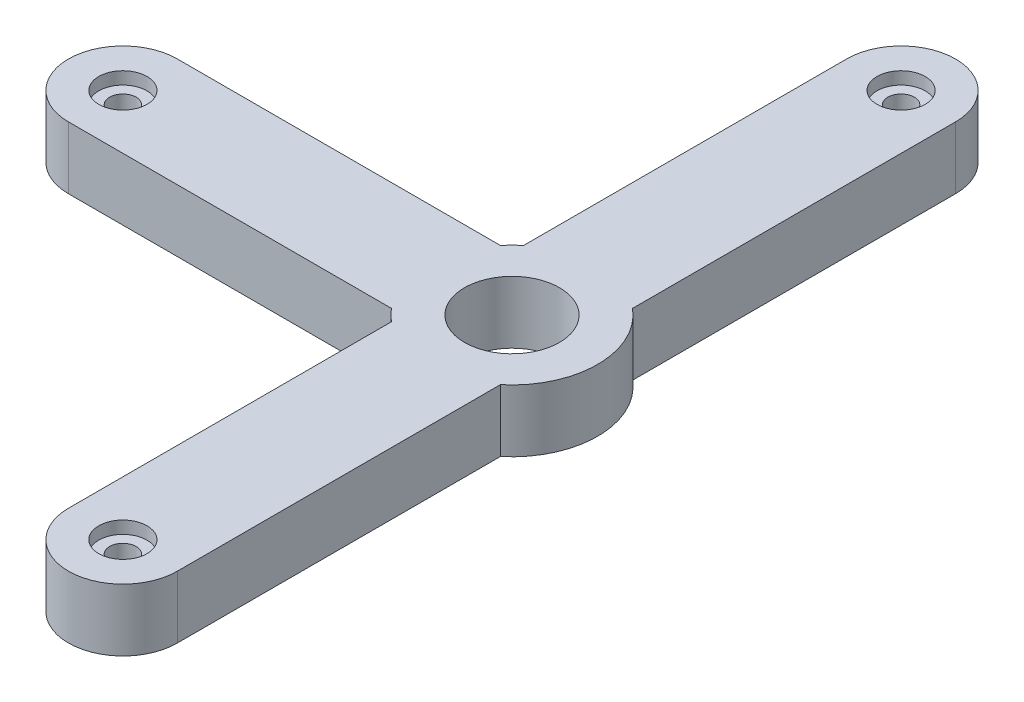
ISO-10303-21;
HEADER;
FILE_DESCRIPTION(('STEP AP214'),'2;1');
FILE_NAME('part.step','',(''),(''),'','','');
FILE_SCHEMA(('AUTOMOTIVE_DESIGN { 1 0 10303 214 1 1 1 1 }'));
ENDSEC;
DATA;
#1=APPLICATION_CONTEXT('core data for automotive mechanical design processes');
#2=APPLICATION_PROTOCOL_DEFINITION('international standard','automotive_design',2000,#1);
#3=PRODUCT_CONTEXT('',#1,'mechanical');
#4=PRODUCT('Part','Part','',(#3));
#5=PRODUCT_RELATED_PRODUCT_CATEGORY('part','',(#4));
#6=PRODUCT_DEFINITION_FORMATION('','',#4);
#7=PRODUCT_DEFINITION_CONTEXT('part definition',#1,'design');
#8=PRODUCT_DEFINITION('design','',#6,#7);
#9=PRODUCT_DEFINITION_SHAPE('','',#8);
#10=(LENGTH_UNIT() NAMED_UNIT(*) SI_UNIT(.MILLI.,.METRE.));
#11=(NAMED_UNIT(*) PLANE_ANGLE_UNIT() SI_UNIT($,.RADIAN.));
#12=(NAMED_UNIT(*) SI_UNIT($,.STERADIAN.) SOLID_ANGLE_UNIT());
#13=UNCERTAINTY_MEASURE_WITH_UNIT(LENGTH_MEASURE(1.E-05),#10,'distance_accuracy_value','');
#14=(GEOMETRIC_REPRESENTATION_CONTEXT(3) GLOBAL_UNCERTAINTY_ASSIGNED_CONTEXT((#13)) GLOBAL_UNIT_ASSIGNED_CONTEXT((#10,
#11,#12)) REPRESENTATION_CONTEXT('',''));
#15=CARTESIAN_POINT('',(0.,0.,0.));
#16=DIRECTION('',(0.,0.,1.));
#17=DIRECTION('',(1.,0.,0.));
#18=AXIS2_PLACEMENT_3D('',#15,#16,#17);
#19=CARTESIAN_POINT('',(-106.291651245989,-150.6,0.));
#20=DIRECTION('',(0.,1.,0.));
#21=DIRECTION('',(0.,0.,1.));
#22=AXIS2_PLACEMENT_3D('',#19,#20,#21);
#23=PLANE('',#22);
#24=CARTESIAN_POINT('',(-106.291651245989,-150.6,0.));
#25=DIRECTION('',(0.,1.,0.));
#26=DIRECTION('',(0.,0.,1.));
#27=AXIS2_PLACEMENT_3D('',#24,#25,#26);
#28=CIRCLE('',#27,1.69999999999999);
#29=CARTESIAN_POINT('',(-106.291651245989,-150.6,1.69999999999999));
#30=VERTEX_POINT('',#29);
#31=EDGE_CURVE('E220',#30,#30,#28,.T.);
#32=ORIENTED_EDGE('',*,*,#31,.F.);
#33=EDGE_LOOP('',(#32));
#34=FACE_BOUND('',#33,.T.);
#35=CARTESIAN_POINT('',(-106.291651245989,-150.6,0.));
#36=DIRECTION('',(0.,1.,0.));
#37=DIRECTION('',(0.,0.,1.));
#38=AXIS2_PLACEMENT_3D('',#35,#36,#37);
#39=CIRCLE('',#38,3.10000000000001);
#40=CARTESIAN_POINT('',(-106.291651245989,-150.6,3.10000000000001));
#41=VERTEX_POINT('',#40);
#42=EDGE_CURVE('E197',#41,#41,#39,.T.);
#43=ORIENTED_EDGE('',*,*,#42,.T.);
#44=EDGE_LOOP('',(#43));
#45=FACE_BOUND('',#44,.T.);
#46=ADVANCED_FACE('F41',(#34,#45),#23,.T.);
#47=CARTESIAN_POINT('',(-56.2916512459885,-150.6,-50.));
#48=DIRECTION('',(0.,1.,0.));
#49=DIRECTION('',(0.,0.,1.));
#50=AXIS2_PLACEMENT_3D('',#47,#48,#49);
#51=CIRCLE('',#50,1.7);
#52=CARTESIAN_POINT('',(-56.2916512459885,-150.6,-48.3));
#53=VERTEX_POINT('',#52);
#54=EDGE_CURVE('E211',#53,#53,#51,.T.);
#55=ORIENTED_EDGE('',*,*,#54,.F.);
#56=EDGE_LOOP('',(#55));
#57=FACE_BOUND('',#56,.T.);
#58=CARTESIAN_POINT('',(-56.2916512459885,-150.6,-50.));
#59=DIRECTION('',(0.,1.,0.));
#60=DIRECTION('',(0.,0.,1.));
#61=AXIS2_PLACEMENT_3D('',#58,#59,#60);
#62=CIRCLE('',#61,3.1);
#63=CARTESIAN_POINT('',(-56.2916512459885,-150.6,-46.9));
#64=VERTEX_POINT('',#63);
#65=EDGE_CURVE('E196',#64,#64,#62,.T.);
#66=ORIENTED_EDGE('',*,*,#65,.T.);
#67=EDGE_LOOP('',(#66));
#68=FACE_BOUND('',#67,.T.);
#69=ADVANCED_FACE('F348',(#57,#68),#23,.T.);
#70=CARTESIAN_POINT('',(-56.2916512459885,-150.6,50.));
#71=DIRECTION('',(0.,1.,0.));
#72=DIRECTION('',(0.,0.,1.));
#73=AXIS2_PLACEMENT_3D('',#70,#71,#72);
#74=CIRCLE('',#73,1.7);
#75=CARTESIAN_POINT('',(-56.2916512459885,-150.6,51.7));
#76=VERTEX_POINT('',#75);
#77=EDGE_CURVE('E212',#76,#76,#74,.T.);
#78=ORIENTED_EDGE('',*,*,#77,.F.);
#79=EDGE_LOOP('',(#78));
#80=FACE_BOUND('',#79,.T.);
#81=CARTESIAN_POINT('',(-56.2916512459885,-150.6,50.));
#82=DIRECTION('',(0.,1.,0.));
#83=DIRECTION('',(0.,0.,1.));
#84=AXIS2_PLACEMENT_3D('',#81,#82,#83);
#85=CIRCLE('',#84,3.1);
#86=CARTESIAN_POINT('',(-56.2916512459885,-150.6,53.1));
#87=VERTEX_POINT('',#86);
#88=EDGE_CURVE('E192',#87,#87,#85,.T.);
#89=ORIENTED_EDGE('',*,*,#88,.T.);
#90=EDGE_LOOP('',(#89));
#91=FACE_BOUND('',#90,.T.);
#92=ADVANCED_FACE('F354',(#80,#91),#23,.T.);
#93=CARTESIAN_POINT('',(-106.291651245989,-157.,0.));
#94=DIRECTION('',(0.,1.,0.));
#95=DIRECTION('',(0.,0.,1.));
#96=AXIS2_PLACEMENT_3D('',#93,#94,#95);
#97=PLANE('',#96);
#98=CARTESIAN_POINT('',(-106.291651245989,-157.,0.));
#99=DIRECTION('',(0.,1.,0.));
#100=DIRECTION('',(0.,0.,1.));
#101=AXIS2_PLACEMENT_3D('',#98,#99,#100);
#102=CIRCLE('',#101,7.);
#103=CARTESIAN_POINT('',(-106.291651245988,-157.,-7.));
#104=VERTEX_POINT('',#103);
#105=CARTESIAN_POINT('',(-106.291651245989,-157.,7.));
#106=VERTEX_POINT('',#105);
#107=EDGE_CURVE('E134',#104,#106,#102,.T.);
#108=ORIENTED_EDGE('',*,*,#107,.F.);
#109=DIRECTION('',(-1.,0.,0.));
#110=VECTOR('',#109,1.);
#111=CARTESIAN_POINT('',(-64.7769326202271,-157.,-7.));
#112=LINE('',#111,#110);
#113=CARTESIAN_POINT('',(-64.7769326202271,-157.,-7.));
#114=VERTEX_POINT('',#113);
#115=EDGE_CURVE('E57',#114,#104,#112,.T.);
#116=ORIENTED_EDGE('',*,*,#115,.F.);
#117=CARTESIAN_POINT('',(-56.2916512459885,-157.,0.));
#118=DIRECTION('',(0.,1.,0.));
#119=DIRECTION('',(0.,0.,1.));
#120=AXIS2_PLACEMENT_3D('',#117,#118,#119);
#121=CIRCLE('',#120,11.);
#122=CARTESIAN_POINT('',(-63.2916512459881,-157.,-8.48528137423894));
#123=VERTEX_POINT('',#122);
#124=EDGE_CURVE('E61',#123,#114,#121,.T.);
#125=ORIENTED_EDGE('',*,*,#124,.F.);
#126=DIRECTION('',(0.,0.,1.));
#127=VECTOR('',#126,1.);
#128=CARTESIAN_POINT('',(-63.2916512459885,-157.,-50.));
#129=LINE('',#128,#127);
#130=CARTESIAN_POINT('',(-63.2916512459885,-157.,-50.));
#131=VERTEX_POINT('',#130);
#132=EDGE_CURVE('E266',#131,#123,#129,.T.);
#133=ORIENTED_EDGE('',*,*,#132,.F.);
#134=CARTESIAN_POINT('',(-56.2916512459885,-157.,-50.));
#135=DIRECTION('',(0.,1.,0.));
#136=DIRECTION('',(0.,0.,1.));
#137=AXIS2_PLACEMENT_3D('',#134,#135,#136);
#138=CIRCLE('',#137,7.);
#139=CARTESIAN_POINT('',(-49.2916512459885,-157.,-50.));
#140=VERTEX_POINT('',#139);
#141=EDGE_CURVE('E264',#140,#131,#138,.T.);
#142=ORIENTED_EDGE('',*,*,#141,.F.);
#143=DIRECTION('',(0.,0.,-1.));
#144=VECTOR('',#143,1.);
#145=CARTESIAN_POINT('',(-49.2916512459885,-157.,-8.48528137423857));
#146=LINE('',#145,#144);
#147=CARTESIAN_POINT('',(-49.2916512459885,-157.,-8.48528137423857));
#148=VERTEX_POINT('',#147);
#149=EDGE_CURVE('E263',#148,#140,#146,.T.);
#150=ORIENTED_EDGE('',*,*,#149,.F.);
#151=CARTESIAN_POINT('',(-56.2916512459885,-157.,0.));
#152=DIRECTION('',(0.,1.,0.));
#153=DIRECTION('',(0.,0.,1.));
#154=AXIS2_PLACEMENT_3D('',#151,#152,#153);
#155=CIRCLE('',#154,11.);
#156=CARTESIAN_POINT('',(-49.2916512459885,-157.,8.48528137423857));
#157=VERTEX_POINT('',#156);
#158=EDGE_CURVE('E261',#157,#148,#155,.T.);
#159=ORIENTED_EDGE('',*,*,#158,.F.);
#160=DIRECTION('',(0.,0.,-1.));
#161=VECTOR('',#160,1.);
#162=CARTESIAN_POINT('',(-49.2916512459885,-157.,50.));
#163=LINE('',#162,#161);
#164=CARTESIAN_POINT('',(-49.2916512459885,-157.,50.));
#165=VERTEX_POINT('',#164);
#166=EDGE_CURVE('E256',#165,#157,#163,.T.);
#167=ORIENTED_EDGE('',*,*,#166,.F.);
#168=CARTESIAN_POINT('',(-56.2916512459885,-157.,50.));
#169=DIRECTION('',(0.,1.,0.));
#170=DIRECTION('',(0.,0.,1.));
#171=AXIS2_PLACEMENT_3D('',#168,#169,#170);
#172=CIRCLE('',#171,7.);
#173=CARTESIAN_POINT('',(-63.2916512459885,-157.,50.));
#174=VERTEX_POINT('',#173);
#175=EDGE_CURVE('E260',#174,#165,#172,.T.);
#176=ORIENTED_EDGE('',*,*,#175,.F.);
#177=DIRECTION('',(0.,0.,1.));
#178=VECTOR('',#177,1.);
#179=CARTESIAN_POINT('',(-63.2916512459881,-157.,8.48528137423894));
#180=LINE('',#179,#178);
#181=CARTESIAN_POINT('',(-63.2916512459881,-157.,8.48528137423891));
#182=VERTEX_POINT('',#181);
#183=EDGE_CURVE('E253',#182,#174,#180,.T.);
#184=ORIENTED_EDGE('',*,*,#183,.F.);
#185=CARTESIAN_POINT('',(-56.2916512459885,-157.,0.));
#186=DIRECTION('',(0.,1.,0.));
#187=DIRECTION('',(0.,0.,1.));
#188=AXIS2_PLACEMENT_3D('',#185,#186,#187);
#189=CIRCLE('',#188,11.);
#190=CARTESIAN_POINT('',(-64.776932620227,-157.,7.));
#191=VERTEX_POINT('',#190);
#192=EDGE_CURVE('E254',#191,#182,#189,.T.);
#193=ORIENTED_EDGE('',*,*,#192,.F.);
#194=DIRECTION('',(1.,0.,0.));
#195=VECTOR('',#194,1.);
#196=CARTESIAN_POINT('',(-106.291651245989,-157.,7.));
#197=LINE('',#196,#195);
#198=EDGE_CURVE('E252',#106,#191,#197,.T.);
#199=ORIENTED_EDGE('',*,*,#198,.F.);
#200=EDGE_LOOP('',(#108,#116,#125,#133,#142,#150,#159,#167,#176,#184,#193,#199));
#201=FACE_BOUND('',#200,.T.);
#202=CARTESIAN_POINT('',(-106.291651245989,-157.,0.));
#203=DIRECTION('',(0.,1.,0.));
#204=DIRECTION('',(0.,0.,1.));
#205=AXIS2_PLACEMENT_3D('',#202,#203,#204);
#206=CIRCLE('',#205,1.69999999999999);
#207=CARTESIAN_POINT('',(-106.291651245989,-157.,1.69999999999999));
#208=VERTEX_POINT('',#207);
#209=EDGE_CURVE('E250',#208,#208,#206,.T.);
#210=ORIENTED_EDGE('',*,*,#209,.T.);
#211=EDGE_LOOP('',(#210));
#212=FACE_BOUND('',#211,.T.);
#213=CARTESIAN_POINT('',(-56.2916512459885,-157.,-50.));
#214=DIRECTION('',(0.,1.,0.));
#215=DIRECTION('',(0.,0.,1.));
#216=AXIS2_PLACEMENT_3D('',#213,#214,#215);
#217=CIRCLE('',#216,1.7);
#218=CARTESIAN_POINT('',(-56.2916512459885,-157.,-48.3));
#219=VERTEX_POINT('',#218);
#220=EDGE_CURVE('E242',#219,#219,#217,.T.);
#221=ORIENTED_EDGE('',*,*,#220,.T.);
#222=EDGE_LOOP('',(#221));
#223=FACE_BOUND('',#222,.T.);
#224=CARTESIAN_POINT('',(-56.2916512459885,-157.,-9.));
#225=DIRECTION('',(0.,1.,0.));
#226=DIRECTION('',(0.,0.,1.));
#227=AXIS2_PLACEMENT_3D('',#224,#225,#226);
#228=CIRCLE('',#227,1.75);
#229=CARTESIAN_POINT('',(-56.2916512459885,-157.,-7.25));
#230=VERTEX_POINT('',#229);
#231=EDGE_CURVE('E237',#230,#230,#228,.T.);
#232=ORIENTED_EDGE('',*,*,#231,.T.);
#233=EDGE_LOOP('',(#232));
#234=FACE_BOUND('',#233,.T.);
#235=CARTESIAN_POINT('',(-65.2916512459885,-157.,0.));
#236=DIRECTION('',(0.,1.,0.));
#237=DIRECTION('',(0.,0.,1.));
#238=AXIS2_PLACEMENT_3D('',#235,#236,#237);
#239=CIRCLE('',#238,1.75);
#240=CARTESIAN_POINT('',(-65.2916512459885,-157.,1.75));
#241=VERTEX_POINT('',#240);
#242=EDGE_CURVE('E234',#241,#241,#239,.T.);
#243=ORIENTED_EDGE('',*,*,#242,.T.);
#244=EDGE_LOOP('',(#243));
#245=FACE_BOUND('',#244,.T.);
#246=CARTESIAN_POINT('',(-56.2916512459885,-157.,0.));
#247=DIRECTION('',(0.,1.,0.));
#248=DIRECTION('',(0.,0.,1.));
#249=AXIS2_PLACEMENT_3D('',#246,#247,#248);
#250=CIRCLE('',#249,6.1);
#251=CARTESIAN_POINT('',(-56.2916512459885,-157.,6.1));
#252=VERTEX_POINT('',#251);
#253=EDGE_CURVE('E233',#252,#252,#250,.T.);
#254=ORIENTED_EDGE('',*,*,#253,.T.);
#255=EDGE_LOOP('',(#254));
#256=FACE_BOUND('',#255,.T.);
#257=CARTESIAN_POINT('',(-56.2916512459885,-157.,9.));
#258=DIRECTION('',(0.,1.,0.));
#259=DIRECTION('',(0.,0.,1.));
#260=AXIS2_PLACEMENT_3D('',#257,#258,#259);
#261=CIRCLE('',#260,1.75);
#262=CARTESIAN_POINT('',(-56.2916512459885,-157.,10.75));
#263=VERTEX_POINT('',#262);
#264=EDGE_CURVE('E223',#263,#263,#261,.T.);
#265=ORIENTED_EDGE('',*,*,#264,.T.);
#266=EDGE_LOOP('',(#265));
#267=FACE_BOUND('',#266,.T.);
#268=CARTESIAN_POINT('',(-56.2916512459885,-157.,50.));
#269=DIRECTION('',(0.,1.,0.));
#270=DIRECTION('',(0.,0.,1.));
#271=AXIS2_PLACEMENT_3D('',#268,#269,#270);
#272=CIRCLE('',#271,1.7);
#273=CARTESIAN_POINT('',(-56.2916512459885,-157.,51.7));
#274=VERTEX_POINT('',#273);
#275=EDGE_CURVE('E224',#274,#274,#272,.T.);
#276=ORIENTED_EDGE('',*,*,#275,.T.);
#277=EDGE_LOOP('',(#276));
#278=FACE_BOUND('',#277,.T.);
#279=ADVANCED_FACE('F305',(#201,#212,#223,#234,#245,#256,#267,#278),#97,.F.);
#280=CARTESIAN_POINT('',(-106.291651245989,-153.,0.));
#281=DIRECTION('',(0.,-1.,0.));
#282=DIRECTION('',(0.,0.,-1.));
#283=AXIS2_PLACEMENT_3D('',#280,#281,#282);
#284=CYLINDRICAL_SURFACE('',#283,7.);
#285=ORIENTED_EDGE('',*,*,#107,.T.);
#286=DIRECTION('',(0.,-1.,0.));
#287=VECTOR('',#286,1.);
#288=CARTESIAN_POINT('',(-106.291651245989,-153.,7.));
#289=LINE('',#288,#287);
#290=CARTESIAN_POINT('',(-106.291651245989,-149.,7.));
#291=VERTEX_POINT('',#290);
#292=EDGE_CURVE('E11',#291,#106,#289,.T.);
#293=ORIENTED_EDGE('',*,*,#292,.F.);
#294=CARTESIAN_POINT('',(-106.291651245989,-149.,0.));
#295=DIRECTION('',(0.,1.,0.));
#296=DIRECTION('',(0.,0.,1.));
#297=AXIS2_PLACEMENT_3D('',#294,#295,#296);
#298=CIRCLE('',#297,7.);
#299=CARTESIAN_POINT('',(-106.291651245988,-149.,-7.));
#300=VERTEX_POINT('',#299);
#301=EDGE_CURVE('E133',#300,#291,#298,.T.);
#302=ORIENTED_EDGE('',*,*,#301,.F.);
#303=DIRECTION('',(0.,-1.,0.));
#304=VECTOR('',#303,1.);
#305=CARTESIAN_POINT('',(-106.291651245988,-153.,-7.));
#306=LINE('',#305,#304);
#307=EDGE_CURVE('E272',#300,#104,#306,.T.);
#308=ORIENTED_EDGE('',*,*,#307,.T.);
#309=EDGE_LOOP('',(#285,#293,#302,#308));
#310=FACE_BOUND('',#309,.T.);
#311=ADVANCED_FACE('F43',(#310),#284,.T.);
#312=CARTESIAN_POINT('',(-106.291651245989,-153.,7.));
#313=DIRECTION('',(0.,0.,-1.));
#314=DIRECTION('',(-1.,0.,0.));
#315=AXIS2_PLACEMENT_3D('',#312,#313,#314);
#316=PLANE('',#315);
#317=ORIENTED_EDGE('',*,*,#198,.T.);
#318=DIRECTION('',(0.,-1.,0.));
#319=VECTOR('',#318,1.);
#320=CARTESIAN_POINT('',(-64.776932620227,-153.,7.));
#321=LINE('',#320,#319);
#322=CARTESIAN_POINT('',(-64.776932620227,-149.,7.));
#323=VERTEX_POINT('',#322);
#324=EDGE_CURVE('E47',#323,#191,#321,.T.);
#325=ORIENTED_EDGE('',*,*,#324,.F.);
#326=DIRECTION('',(1.,0.,0.));
#327=VECTOR('',#326,1.);
#328=CARTESIAN_POINT('',(-106.291651245989,-149.,7.));
#329=LINE('',#328,#327);
#330=EDGE_CURVE('E140',#291,#323,#329,.T.);
#331=ORIENTED_EDGE('',*,*,#330,.F.);
#332=ORIENTED_EDGE('',*,*,#292,.T.);
#333=EDGE_LOOP('',(#317,#325,#331,#332));
#334=FACE_BOUND('',#333,.T.);
#335=ADVANCED_FACE('F138',(#334),#316,.F.);
#336=CARTESIAN_POINT('',(-56.2916512459885,-153.,0.));
#337=DIRECTION('',(0.,-1.,0.));
#338=DIRECTION('',(0.,0.,-1.));
#339=AXIS2_PLACEMENT_3D('',#336,#337,#338);
#340=CYLINDRICAL_SURFACE('',#339,11.);
#341=ORIENTED_EDGE('',*,*,#192,.T.);
#342=DIRECTION('',(0.,-1.,0.));
#343=VECTOR('',#342,1.);
#344=CARTESIAN_POINT('',(-63.2916512459881,-153.,8.48528137423891));
#345=LINE('',#344,#343);
#346=CARTESIAN_POINT('',(-63.2916512459881,-149.,8.48528137423891));
#347=VERTEX_POINT('',#346);
#348=EDGE_CURVE('E294',#347,#182,#345,.T.);
#349=ORIENTED_EDGE('',*,*,#348,.F.);
#350=CARTESIAN_POINT('',(-56.2916512459885,-149.,0.));
#351=DIRECTION('',(0.,1.,0.));
#352=DIRECTION('',(0.,0.,1.));
#353=AXIS2_PLACEMENT_3D('',#350,#351,#352);
#354=CIRCLE('',#353,11.);
#355=EDGE_CURVE('E144',#323,#347,#354,.T.);
#356=ORIENTED_EDGE('',*,*,#355,.F.);
#357=ORIENTED_EDGE('',*,*,#324,.T.);
#358=EDGE_LOOP('',(#341,#349,#356,#357));
#359=FACE_BOUND('',#358,.T.);
#360=ADVANCED_FACE('F299',(#359),#340,.T.);
#361=CARTESIAN_POINT('',(-63.2916512459881,-153.,8.48528137423894));
#362=DIRECTION('',(1.,0.,0.));
#363=DIRECTION('',(0.,0.,-1.));
#364=AXIS2_PLACEMENT_3D('',#361,#362,#363);
#365=PLANE('',#364);
#366=ORIENTED_EDGE('',*,*,#183,.T.);
#367=DIRECTION('',(0.,-1.,0.));
#368=VECTOR('',#367,1.);
#369=CARTESIAN_POINT('',(-63.2916512459885,-153.,50.));
#370=LINE('',#369,#368);
#371=CARTESIAN_POINT('',(-63.2916512459885,-149.,50.));
#372=VERTEX_POINT('',#371);
#373=EDGE_CURVE('E292',#372,#174,#370,.T.);
#374=ORIENTED_EDGE('',*,*,#373,.F.);
#375=DIRECTION('',(0.,0.,1.));
#376=VECTOR('',#375,1.);
#377=CARTESIAN_POINT('',(-63.2916512459881,-149.,8.48528137423894));
#378=LINE('',#377,#376);
#379=EDGE_CURVE('E157',#347,#372,#378,.T.);
#380=ORIENTED_EDGE('',*,*,#379,.F.);
#381=ORIENTED_EDGE('',*,*,#348,.T.);
#382=EDGE_LOOP('',(#366,#374,#380,#381));
#383=FACE_BOUND('',#382,.T.);
#384=ADVANCED_FACE('F310',(#383),#365,.F.);
#385=CARTESIAN_POINT('',(-56.2916512459885,-153.,50.));
#386=DIRECTION('',(0.,-1.,0.));
#387=DIRECTION('',(0.,0.,-1.));
#388=AXIS2_PLACEMENT_3D('',#385,#386,#387);
#389=CYLINDRICAL_SURFACE('',#388,7.);
#390=ORIENTED_EDGE('',*,*,#175,.T.);
#391=DIRECTION('',(0.,-1.,0.));
#392=VECTOR('',#391,1.);
#393=CARTESIAN_POINT('',(-49.2916512459885,-153.,50.));
#394=LINE('',#393,#392);
#395=CARTESIAN_POINT('',(-49.2916512459885,-149.,50.));
#396=VERTEX_POINT('',#395);
#397=EDGE_CURVE('E288',#396,#165,#394,.T.);
#398=ORIENTED_EDGE('',*,*,#397,.F.);
#399=CARTESIAN_POINT('',(-56.2916512459885,-149.,50.));
#400=DIRECTION('',(0.,1.,0.));
#401=DIRECTION('',(0.,0.,1.));
#402=AXIS2_PLACEMENT_3D('',#399,#400,#401);
#403=CIRCLE('',#402,7.);
#404=EDGE_CURVE('E161',#372,#396,#403,.T.);
#405=ORIENTED_EDGE('',*,*,#404,.F.);
#406=ORIENTED_EDGE('',*,*,#373,.T.);
#407=EDGE_LOOP('',(#390,#398,#405,#406));
#408=FACE_BOUND('',#407,.T.);
#409=ADVANCED_FACE('F311',(#408),#389,.T.);
#410=CARTESIAN_POINT('',(-49.2916512459885,-153.,50.));
#411=DIRECTION('',(-1.,0.,0.));
#412=DIRECTION('',(0.,0.,1.));
#413=AXIS2_PLACEMENT_3D('',#410,#411,#412);
#414=PLANE('',#413);
#415=ORIENTED_EDGE('',*,*,#166,.T.);
#416=DIRECTION('',(0.,-1.,0.));
#417=VECTOR('',#416,1.);
#418=CARTESIAN_POINT('',(-49.2916512459885,-153.,8.48528137423857));
#419=LINE('',#418,#417);
#420=CARTESIAN_POINT('',(-49.2916512459885,-149.,8.48528137423857));
#421=VERTEX_POINT('',#420);
#422=EDGE_CURVE('E289',#421,#157,#419,.T.);
#423=ORIENTED_EDGE('',*,*,#422,.F.);
#424=DIRECTION('',(0.,0.,-1.));
#425=VECTOR('',#424,1.);
#426=CARTESIAN_POINT('',(-49.2916512459885,-149.,50.));
#427=LINE('',#426,#425);
#428=EDGE_CURVE('E168',#396,#421,#427,.T.);
#429=ORIENTED_EDGE('',*,*,#428,.F.);
#430=ORIENTED_EDGE('',*,*,#397,.T.);
#431=EDGE_LOOP('',(#415,#423,#429,#430));
#432=FACE_BOUND('',#431,.T.);
#433=ADVANCED_FACE('F314',(#432),#414,.F.);
#434=CARTESIAN_POINT('',(-56.2916512459885,-153.,0.));
#435=DIRECTION('',(0.,-1.,0.));
#436=DIRECTION('',(0.,0.,-1.));
#437=AXIS2_PLACEMENT_3D('',#434,#435,#436);
#438=CYLINDRICAL_SURFACE('',#437,11.);
#439=ORIENTED_EDGE('',*,*,#158,.T.);
#440=DIRECTION('',(0.,-1.,0.));
#441=VECTOR('',#440,1.);
#442=CARTESIAN_POINT('',(-49.2916512459885,-153.,-8.48528137423857));
#443=LINE('',#442,#441);
#444=CARTESIAN_POINT('',(-49.2916512459885,-149.,-8.48528137423857));
#445=VERTEX_POINT('',#444);
#446=EDGE_CURVE('E283',#445,#148,#443,.T.);
#447=ORIENTED_EDGE('',*,*,#446,.F.);
#448=CARTESIAN_POINT('',(-56.2916512459885,-149.,0.));
#449=DIRECTION('',(0.,1.,0.));
#450=DIRECTION('',(0.,0.,1.));
#451=AXIS2_PLACEMENT_3D('',#448,#449,#450);
#452=CIRCLE('',#451,11.);
#453=EDGE_CURVE('E169',#421,#445,#452,.T.);
#454=ORIENTED_EDGE('',*,*,#453,.F.);
#455=ORIENTED_EDGE('',*,*,#422,.T.);
#456=EDGE_LOOP('',(#439,#447,#454,#455));
#457=FACE_BOUND('',#456,.T.);
#458=ADVANCED_FACE('F319',(#457),#438,.T.);
#459=CARTESIAN_POINT('',(-49.2916512459885,-153.,-8.48528137423857));
#460=DIRECTION('',(-1.,0.,0.));
#461=DIRECTION('',(0.,0.,1.));
#462=AXIS2_PLACEMENT_3D('',#459,#460,#461);
#463=PLANE('',#462);
#464=ORIENTED_EDGE('',*,*,#149,.T.);
#465=DIRECTION('',(0.,-1.,0.));
#466=VECTOR('',#465,1.);
#467=CARTESIAN_POINT('',(-49.2916512459885,-153.,-50.));
#468=LINE('',#467,#466);
#469=CARTESIAN_POINT('',(-49.2916512459885,-149.,-50.));
#470=VERTEX_POINT('',#469);
#471=EDGE_CURVE('E278',#470,#140,#468,.T.);
#472=ORIENTED_EDGE('',*,*,#471,.F.);
#473=DIRECTION('',(0.,0.,-1.));
#474=VECTOR('',#473,1.);
#475=CARTESIAN_POINT('',(-49.2916512459885,-149.,-8.48528137423857));
#476=LINE('',#475,#474);
#477=EDGE_CURVE('E175',#445,#470,#476,.T.);
#478=ORIENTED_EDGE('',*,*,#477,.F.);
#479=ORIENTED_EDGE('',*,*,#446,.T.);
#480=EDGE_LOOP('',(#464,#472,#478,#479));
#481=FACE_BOUND('',#480,.T.);
#482=ADVANCED_FACE('F324',(#481),#463,.F.);
#483=CARTESIAN_POINT('',(-56.2916512459885,-153.,-50.));
#484=DIRECTION('',(0.,-1.,0.));
#485=DIRECTION('',(0.,0.,-1.));
#486=AXIS2_PLACEMENT_3D('',#483,#484,#485);
#487=CYLINDRICAL_SURFACE('',#486,7.);
#488=ORIENTED_EDGE('',*,*,#141,.T.);
#489=DIRECTION('',(0.,-1.,0.));
#490=VECTOR('',#489,1.);
#491=CARTESIAN_POINT('',(-63.2916512459885,-153.,-50.));
#492=LINE('',#491,#490);
#493=CARTESIAN_POINT('',(-63.2916512459885,-149.,-50.));
#494=VERTEX_POINT('',#493);
#495=EDGE_CURVE('E280',#494,#131,#492,.T.);
#496=ORIENTED_EDGE('',*,*,#495,.F.);
#497=CARTESIAN_POINT('',(-56.2916512459885,-149.,-50.));
#498=DIRECTION('',(0.,1.,0.));
#499=DIRECTION('',(0.,0.,1.));
#500=AXIS2_PLACEMENT_3D('',#497,#498,#499);
#501=CIRCLE('',#500,7.);
#502=EDGE_CURVE('E174',#470,#494,#501,.T.);
#503=ORIENTED_EDGE('',*,*,#502,.F.);
#504=ORIENTED_EDGE('',*,*,#471,.T.);
#505=EDGE_LOOP('',(#488,#496,#503,#504));
#506=FACE_BOUND('',#505,.T.);
#507=ADVANCED_FACE('F330',(#506),#487,.T.);
#508=CARTESIAN_POINT('',(-63.2916512459885,-153.,-50.));
#509=DIRECTION('',(1.,0.,0.));
#510=DIRECTION('',(0.,0.,-1.));
#511=AXIS2_PLACEMENT_3D('',#508,#509,#510);
#512=PLANE('',#511);
#513=ORIENTED_EDGE('',*,*,#132,.T.);
#514=DIRECTION('',(0.,-1.,0.));
#515=VECTOR('',#514,1.);
#516=CARTESIAN_POINT('',(-63.2916512459881,-153.,-8.48528137423894));
#517=LINE('',#516,#515);
#518=CARTESIAN_POINT('',(-63.2916512459881,-149.,-8.48528137423894));
#519=VERTEX_POINT('',#518);
#520=EDGE_CURVE('E273',#519,#123,#517,.T.);
#521=ORIENTED_EDGE('',*,*,#520,.F.);
#522=DIRECTION('',(0.,0.,1.));
#523=VECTOR('',#522,1.);
#524=CARTESIAN_POINT('',(-63.2916512459885,-149.,-50.));
#525=LINE('',#524,#523);
#526=EDGE_CURVE('E178',#494,#519,#525,.T.);
#527=ORIENTED_EDGE('',*,*,#526,.F.);
#528=ORIENTED_EDGE('',*,*,#495,.T.);
#529=EDGE_LOOP('',(#513,#521,#527,#528));
#530=FACE_BOUND('',#529,.T.);
#531=ADVANCED_FACE('F334',(#530),#512,.F.);
#532=CARTESIAN_POINT('',(-56.2916512459885,-153.,0.));
#533=DIRECTION('',(0.,-1.,0.));
#534=DIRECTION('',(0.,0.,-1.));
#535=AXIS2_PLACEMENT_3D('',#532,#533,#534);
#536=CYLINDRICAL_SURFACE('',#535,11.);
#537=ORIENTED_EDGE('',*,*,#124,.T.);
#538=DIRECTION('',(0.,-1.,0.));
#539=VECTOR('',#538,1.);
#540=CARTESIAN_POINT('',(-64.7769326202271,-153.,-7.));
#541=LINE('',#540,#539);
#542=CARTESIAN_POINT('',(-64.7769326202271,-149.,-7.));
#543=VERTEX_POINT('',#542);
#544=EDGE_CURVE('E271',#543,#114,#541,.T.);
#545=ORIENTED_EDGE('',*,*,#544,.F.);
#546=CARTESIAN_POINT('',(-56.2916512459885,-149.,0.));
#547=DIRECTION('',(0.,1.,0.));
#548=DIRECTION('',(0.,0.,1.));
#549=AXIS2_PLACEMENT_3D('',#546,#547,#548);
#550=CIRCLE('',#549,11.);
#551=EDGE_CURVE('E181',#519,#543,#550,.T.);
#552=ORIENTED_EDGE('',*,*,#551,.F.);
#553=ORIENTED_EDGE('',*,*,#520,.T.);
#554=EDGE_LOOP('',(#537,#545,#552,#553));
#555=FACE_BOUND('',#554,.T.);
#556=ADVANCED_FACE('F331',(#555),#536,.T.);
#557=CARTESIAN_POINT('',(-64.7769326202271,-153.,-7.));
#558=DIRECTION('',(0.,0.,1.));
#559=DIRECTION('',(1.,0.,0.));
#560=AXIS2_PLACEMENT_3D('',#557,#558,#559);
#561=PLANE('',#560);
#562=ORIENTED_EDGE('',*,*,#115,.T.);
#563=ORIENTED_EDGE('',*,*,#307,.F.);
#564=DIRECTION('',(-1.,0.,0.));
#565=VECTOR('',#564,1.);
#566=CARTESIAN_POINT('',(-64.7769326202271,-149.,-7.));
#567=LINE('',#566,#565);
#568=EDGE_CURVE('E151',#543,#300,#567,.T.);
#569=ORIENTED_EDGE('',*,*,#568,.F.);
#570=ORIENTED_EDGE('',*,*,#544,.T.);
#571=EDGE_LOOP('',(#562,#563,#569,#570));
#572=FACE_BOUND('',#571,.T.);
#573=ADVANCED_FACE('F335',(#572),#561,.F.);
#574=CARTESIAN_POINT('',(-106.291651245989,-153.,0.));
#575=DIRECTION('',(0.,-1.,0.));
#576=DIRECTION('',(0.,0.,-1.));
#577=AXIS2_PLACEMENT_3D('',#574,#575,#576);
#578=CYLINDRICAL_SURFACE('',#577,1.69999999999999);
#579=ORIENTED_EDGE('',*,*,#209,.F.);
#580=EDGE_LOOP('',(#579));
#581=FACE_BOUND('',#580,.T.);
#582=ORIENTED_EDGE('',*,*,#31,.T.);
#583=EDGE_LOOP('',(#582));
#584=FACE_BOUND('',#583,.T.);
#585=ADVANCED_FACE('F332',(#581,#584),#578,.F.);
#586=CARTESIAN_POINT('',(-56.2916512459885,-153.,-50.));
#587=DIRECTION('',(0.,-1.,0.));
#588=DIRECTION('',(0.,0.,-1.));
#589=AXIS2_PLACEMENT_3D('',#586,#587,#588);
#590=CYLINDRICAL_SURFACE('',#589,1.7);
#591=ORIENTED_EDGE('',*,*,#220,.F.);
#592=EDGE_LOOP('',(#591));
#593=FACE_BOUND('',#592,.T.);
#594=ORIENTED_EDGE('',*,*,#54,.T.);
#595=EDGE_LOOP('',(#594));
#596=FACE_BOUND('',#595,.T.);
#597=ADVANCED_FACE('F345',(#593,#596),#590,.F.);
#598=CARTESIAN_POINT('',(-56.2916512459885,-153.,-9.));
#599=DIRECTION('',(0.,-1.,0.));
#600=DIRECTION('',(0.,0.,-1.));
#601=AXIS2_PLACEMENT_3D('',#598,#599,#600);
#602=CYLINDRICAL_SURFACE('',#601,1.75);
#603=CARTESIAN_POINT('',(-56.2916512459885,-153.,-9.));
#604=DIRECTION('',(0.,1.,0.));
#605=DIRECTION('',(0.,0.,1.));
#606=AXIS2_PLACEMENT_3D('',#603,#604,#605);
#607=CIRCLE('',#606,1.75);
#608=CARTESIAN_POINT('',(-56.2916512459885,-153.,-7.25));
#609=VERTEX_POINT('',#608);
#610=EDGE_CURVE('E219',#609,#609,#607,.T.);
#611=ORIENTED_EDGE('',*,*,#610,.T.);
#612=EDGE_LOOP('',(#611));
#613=FACE_BOUND('',#612,.T.);
#614=ORIENTED_EDGE('',*,*,#231,.F.);
#615=EDGE_LOOP('',(#614));
#616=FACE_BOUND('',#615,.T.);
#617=ADVANCED_FACE('F664',(#613,#616),#602,.F.);
#618=CARTESIAN_POINT('',(-65.2916512459885,-153.,0.));
#619=DIRECTION('',(0.,-1.,0.));
#620=DIRECTION('',(0.,0.,-1.));
#621=AXIS2_PLACEMENT_3D('',#618,#619,#620);
#622=CYLINDRICAL_SURFACE('',#621,1.75);
#623=CARTESIAN_POINT('',(-65.2916512459885,-153.,0.));
#624=DIRECTION('',(0.,1.,0.));
#625=DIRECTION('',(0.,0.,1.));
#626=AXIS2_PLACEMENT_3D('',#623,#624,#625);
#627=CIRCLE('',#626,1.75);
#628=CARTESIAN_POINT('',(-65.2916512459885,-153.,1.75));
#629=VERTEX_POINT('',#628);
#630=EDGE_CURVE('E226',#629,#629,#627,.T.);
#631=ORIENTED_EDGE('',*,*,#630,.T.);
#632=EDGE_LOOP('',(#631));
#633=FACE_BOUND('',#632,.T.);
#634=ORIENTED_EDGE('',*,*,#242,.F.);
#635=EDGE_LOOP('',(#634));
#636=FACE_BOUND('',#635,.T.);
#637=ADVANCED_FACE('F458',(#633,#636),#622,.F.);
#638=CARTESIAN_POINT('',(-56.2916512459885,-153.,0.));
#639=DIRECTION('',(0.,-1.,0.));
#640=DIRECTION('',(0.,0.,-1.));
#641=AXIS2_PLACEMENT_3D('',#638,#639,#640);
#642=CYLINDRICAL_SURFACE('',#641,6.1);
#643=ORIENTED_EDGE('',*,*,#253,.F.);
#644=EDGE_LOOP('',(#643));
#645=FACE_BOUND('',#644,.T.);
#646=CARTESIAN_POINT('',(-56.2916512459885,-149.,0.));
#647=DIRECTION('',(0.,1.,0.));
#648=DIRECTION('',(0.,0.,1.));
#649=AXIS2_PLACEMENT_3D('',#646,#647,#648);
#650=CIRCLE('',#649,6.1);
#651=CARTESIAN_POINT('',(-56.2916512459885,-149.,6.1));
#652=VERTEX_POINT('',#651);
#653=EDGE_CURVE('E155',#652,#652,#650,.T.);
#654=ORIENTED_EDGE('',*,*,#653,.T.);
#655=EDGE_LOOP('',(#654));
#656=FACE_BOUND('',#655,.T.);
#657=ADVANCED_FACE('F453',(#645,#656),#642,.F.);
#658=CARTESIAN_POINT('',(-56.2916512459885,-153.,9.));
#659=DIRECTION('',(0.,-1.,0.));
#660=DIRECTION('',(0.,0.,-1.));
#661=AXIS2_PLACEMENT_3D('',#658,#659,#660);
#662=CYLINDRICAL_SURFACE('',#661,1.75);
#663=CARTESIAN_POINT('',(-56.2916512459885,-153.,9.));
#664=DIRECTION('',(0.,1.,0.));
#665=DIRECTION('',(0.,0.,1.));
#666=AXIS2_PLACEMENT_3D('',#663,#664,#665);
#667=CIRCLE('',#666,1.75);
#668=CARTESIAN_POINT('',(-56.2916512459885,-153.,10.75));
#669=VERTEX_POINT('',#668);
#670=EDGE_CURVE('E222',#669,#669,#667,.T.);
#671=ORIENTED_EDGE('',*,*,#670,.T.);
#672=EDGE_LOOP('',(#671));
#673=FACE_BOUND('',#672,.T.);
#674=ORIENTED_EDGE('',*,*,#264,.F.);
#675=EDGE_LOOP('',(#674));
#676=FACE_BOUND('',#675,.T.);
#677=ADVANCED_FACE('F460',(#673,#676),#662,.F.);
#678=CARTESIAN_POINT('',(-56.2916512459885,-153.,50.));
#679=DIRECTION('',(0.,-1.,0.));
#680=DIRECTION('',(0.,0.,-1.));
#681=AXIS2_PLACEMENT_3D('',#678,#679,#680);
#682=CYLINDRICAL_SURFACE('',#681,1.7);
#683=ORIENTED_EDGE('',*,*,#275,.F.);
#684=EDGE_LOOP('',(#683));
#685=FACE_BOUND('',#684,.T.);
#686=ORIENTED_EDGE('',*,*,#77,.T.);
#687=EDGE_LOOP('',(#686));
#688=FACE_BOUND('',#687,.T.);
#689=ADVANCED_FACE('F636',(#685,#688),#682,.F.);
#690=CARTESIAN_POINT('',(-106.291651245989,-153.,0.));
#691=DIRECTION('',(0.,1.,0.));
#692=DIRECTION('',(0.,0.,1.));
#693=AXIS2_PLACEMENT_3D('',#690,#691,#692);
#694=PLANE('',#693);
#695=CARTESIAN_POINT('',(-56.2916512459885,-153.,9.));
#696=DIRECTION('',(0.,1.,0.));
#697=DIRECTION('',(0.,0.,1.));
#698=AXIS2_PLACEMENT_3D('',#695,#696,#697);
#699=CIRCLE('',#698,1.1);
#700=CARTESIAN_POINT('',(-56.2916512459885,-153.,10.1));
#701=VERTEX_POINT('',#700);
#702=EDGE_CURVE('E201',#701,#701,#699,.T.);
#703=ORIENTED_EDGE('',*,*,#702,.T.);
#704=EDGE_LOOP('',(#703));
#705=FACE_BOUND('',#704,.T.);
#706=ORIENTED_EDGE('',*,*,#670,.F.);
#707=EDGE_LOOP('',(#706));
#708=FACE_BOUND('',#707,.T.);
#709=ADVANCED_FACE('F422',(#705,#708),#694,.F.);
#710=CARTESIAN_POINT('',(-65.2916512459885,-153.,0.));
#711=DIRECTION('',(0.,1.,0.));
#712=DIRECTION('',(0.,0.,1.));
#713=AXIS2_PLACEMENT_3D('',#710,#711,#712);
#714=CIRCLE('',#713,1.1);
#715=CARTESIAN_POINT('',(-65.2916512459885,-153.,1.1));
#716=VERTEX_POINT('',#715);
#717=EDGE_CURVE('E202',#716,#716,#714,.T.);
#718=ORIENTED_EDGE('',*,*,#717,.T.);
#719=EDGE_LOOP('',(#718));
#720=FACE_BOUND('',#719,.T.);
#721=ORIENTED_EDGE('',*,*,#630,.F.);
#722=EDGE_LOOP('',(#721));
#723=FACE_BOUND('',#722,.T.);
#724=ADVANCED_FACE('F417',(#720,#723),#694,.F.);
#725=CARTESIAN_POINT('',(-56.2916512459885,-153.,-9.));
#726=DIRECTION('',(0.,1.,0.));
#727=DIRECTION('',(0.,0.,1.));
#728=AXIS2_PLACEMENT_3D('',#725,#726,#727);
#729=CIRCLE('',#728,1.1);
#730=CARTESIAN_POINT('',(-56.2916512459885,-153.,-7.9));
#731=VERTEX_POINT('',#730);
#732=EDGE_CURVE('E206',#731,#731,#729,.T.);
#733=ORIENTED_EDGE('',*,*,#732,.T.);
#734=EDGE_LOOP('',(#733));
#735=FACE_BOUND('',#734,.T.);
#736=ORIENTED_EDGE('',*,*,#610,.F.);
#737=EDGE_LOOP('',(#736));
#738=FACE_BOUND('',#737,.T.);
#739=ADVANCED_FACE('F419',(#735,#738),#694,.F.);
#740=CARTESIAN_POINT('',(-56.2916512459885,-150.6,-9.));
#741=DIRECTION('',(0.,-1.,0.));
#742=DIRECTION('',(0.,0.,-1.));
#743=AXIS2_PLACEMENT_3D('',#740,#741,#742);
#744=CYLINDRICAL_SURFACE('',#743,1.1);
#745=ORIENTED_EDGE('',*,*,#732,.F.);
#746=EDGE_LOOP('',(#745));
#747=FACE_BOUND('',#746,.T.);
#748=CARTESIAN_POINT('',(-56.2916512459885,-150.,-9.));
#749=DIRECTION('',(0.,1.,0.));
#750=DIRECTION('',(0.,0.,1.));
#751=AXIS2_PLACEMENT_3D('',#748,#749,#750);
#752=CIRCLE('',#751,1.1);
#753=CARTESIAN_POINT('',(-56.2916512459885,-150.,-7.9));
#754=VERTEX_POINT('',#753);
#755=EDGE_CURVE('E190',#754,#754,#752,.T.);
#756=ORIENTED_EDGE('',*,*,#755,.T.);
#757=EDGE_LOOP('',(#756));
#758=FACE_BOUND('',#757,.T.);
#759=ADVANCED_FACE('F412',(#747,#758),#744,.F.);
#760=CARTESIAN_POINT('',(-65.2916512459885,-150.6,0.));
#761=DIRECTION('',(0.,-1.,0.));
#762=DIRECTION('',(0.,0.,-1.));
#763=AXIS2_PLACEMENT_3D('',#760,#761,#762);
#764=CYLINDRICAL_SURFACE('',#763,1.1);
#765=ORIENTED_EDGE('',*,*,#717,.F.);
#766=EDGE_LOOP('',(#765));
#767=FACE_BOUND('',#766,.T.);
#768=CARTESIAN_POINT('',(-65.2916512459885,-150.,0.));
#769=DIRECTION('',(0.,1.,0.));
#770=DIRECTION('',(0.,0.,1.));
#771=AXIS2_PLACEMENT_3D('',#768,#769,#770);
#772=CIRCLE('',#771,1.1);
#773=CARTESIAN_POINT('',(-65.2916512459885,-150.,1.1));
#774=VERTEX_POINT('',#773);
#775=EDGE_CURVE('E189',#774,#774,#772,.T.);
#776=ORIENTED_EDGE('',*,*,#775,.T.);
#777=EDGE_LOOP('',(#776));
#778=FACE_BOUND('',#777,.T.);
#779=ADVANCED_FACE('F411',(#767,#778),#764,.F.);
#780=CARTESIAN_POINT('',(-56.2916512459885,-150.6,9.));
#781=DIRECTION('',(0.,-1.,0.));
#782=DIRECTION('',(0.,0.,-1.));
#783=AXIS2_PLACEMENT_3D('',#780,#781,#782);
#784=CYLINDRICAL_SURFACE('',#783,1.1);
#785=ORIENTED_EDGE('',*,*,#702,.F.);
#786=EDGE_LOOP('',(#785));
#787=FACE_BOUND('',#786,.T.);
#788=CARTESIAN_POINT('',(-56.2916512459885,-150.,9.));
#789=DIRECTION('',(0.,1.,0.));
#790=DIRECTION('',(0.,0.,1.));
#791=AXIS2_PLACEMENT_3D('',#788,#789,#790);
#792=CIRCLE('',#791,1.1);
#793=CARTESIAN_POINT('',(-56.2916512459885,-150.,10.1));
#794=VERTEX_POINT('',#793);
#795=EDGE_CURVE('E183',#794,#794,#792,.T.);
#796=ORIENTED_EDGE('',*,*,#795,.T.);
#797=EDGE_LOOP('',(#796));
#798=FACE_BOUND('',#797,.T.);
#799=ADVANCED_FACE('F410',(#787,#798),#784,.F.);
#800=CARTESIAN_POINT('',(-106.291651245989,-150.,0.));
#801=DIRECTION('',(0.,-1.,0.));
#802=DIRECTION('',(0.,0.,-1.));
#803=AXIS2_PLACEMENT_3D('',#800,#801,#802);
#804=CYLINDRICAL_SURFACE('',#803,3.10000000000001);
#805=ORIENTED_EDGE('',*,*,#42,.F.);
#806=EDGE_LOOP('',(#805));
#807=FACE_BOUND('',#806,.T.);
#808=CARTESIAN_POINT('',(-106.291651245989,-149.,0.));
#809=DIRECTION('',(0.,1.,0.));
#810=DIRECTION('',(0.,0.,1.));
#811=AXIS2_PLACEMENT_3D('',#808,#809,#810);
#812=CIRCLE('',#811,3.10000000000001);
#813=CARTESIAN_POINT('',(-106.291651245989,-149.,3.10000000000001));
#814=VERTEX_POINT('',#813);
#815=EDGE_CURVE('E154',#814,#814,#812,.T.);
#816=ORIENTED_EDGE('',*,*,#815,.T.);
#817=EDGE_LOOP('',(#816));
#818=FACE_BOUND('',#817,.T.);
#819=ADVANCED_FACE('F389',(#807,#818),#804,.F.);
#820=CARTESIAN_POINT('',(-56.2916512459885,-150.,-50.));
#821=DIRECTION('',(0.,-1.,0.));
#822=DIRECTION('',(0.,0.,-1.));
#823=AXIS2_PLACEMENT_3D('',#820,#821,#822);
#824=CYLINDRICAL_SURFACE('',#823,3.1);
#825=ORIENTED_EDGE('',*,*,#65,.F.);
#826=EDGE_LOOP('',(#825));
#827=FACE_BOUND('',#826,.T.);
#828=CARTESIAN_POINT('',(-56.2916512459885,-149.,-50.));
#829=DIRECTION('',(0.,1.,0.));
#830=DIRECTION('',(0.,0.,1.));
#831=AXIS2_PLACEMENT_3D('',#828,#829,#830);
#832=CIRCLE('',#831,3.1);
#833=CARTESIAN_POINT('',(-56.2916512459885,-149.,-46.9));
#834=VERTEX_POINT('',#833);
#835=EDGE_CURVE('E382',#834,#834,#832,.T.);
#836=ORIENTED_EDGE('',*,*,#835,.T.);
#837=EDGE_LOOP('',(#836));
#838=FACE_BOUND('',#837,.T.);
#839=ADVANCED_FACE('F374',(#827,#838),#824,.F.);
#840=CARTESIAN_POINT('',(-56.2916512459885,-150.,50.));
#841=DIRECTION('',(0.,-1.,0.));
#842=DIRECTION('',(0.,0.,-1.));
#843=AXIS2_PLACEMENT_3D('',#840,#841,#842);
#844=CYLINDRICAL_SURFACE('',#843,3.1);
#845=ORIENTED_EDGE('',*,*,#88,.F.);
#846=EDGE_LOOP('',(#845));
#847=FACE_BOUND('',#846,.T.);
#848=CARTESIAN_POINT('',(-56.2916512459885,-149.,50.));
#849=DIRECTION('',(0.,1.,0.));
#850=DIRECTION('',(0.,0.,1.));
#851=AXIS2_PLACEMENT_3D('',#848,#849,#850);
#852=CIRCLE('',#851,3.1);
#853=CARTESIAN_POINT('',(-56.2916512459885,-149.,53.1));
#854=VERTEX_POINT('',#853);
#855=EDGE_CURVE('E378',#854,#854,#852,.T.);
#856=ORIENTED_EDGE('',*,*,#855,.T.);
#857=EDGE_LOOP('',(#856));
#858=FACE_BOUND('',#857,.T.);
#859=ADVANCED_FACE('F371',(#847,#858),#844,.F.);
#860=CARTESIAN_POINT('',(-106.291651245989,-150.,0.));
#861=DIRECTION('',(0.,1.,0.));
#862=DIRECTION('',(0.,0.,1.));
#863=AXIS2_PLACEMENT_3D('',#860,#861,#862);
#864=PLANE('',#863);
#865=ORIENTED_EDGE('',*,*,#795,.F.);
#866=EDGE_LOOP('',(#865));
#867=FACE_BOUND('',#866,.T.);
#868=ADVANCED_FACE('F372',(#867),#864,.F.);
#869=ORIENTED_EDGE('',*,*,#755,.F.);
#870=EDGE_LOOP('',(#869));
#871=FACE_BOUND('',#870,.T.);
#872=ADVANCED_FACE('F399',(#871),#864,.F.);
#873=ORIENTED_EDGE('',*,*,#775,.F.);
#874=EDGE_LOOP('',(#873));
#875=FACE_BOUND('',#874,.T.);
#876=ADVANCED_FACE('F388',(#875),#864,.F.);
#877=CARTESIAN_POINT('',(-106.291651245989,-149.,0.));
#878=DIRECTION('',(0.,1.,0.));
#879=DIRECTION('',(0.,0.,1.));
#880=AXIS2_PLACEMENT_3D('',#877,#878,#879);
#881=PLANE('',#880);
#882=ORIENTED_EDGE('',*,*,#835,.F.);
#883=EDGE_LOOP('',(#882));
#884=FACE_BOUND('',#883,.T.);
#885=ORIENTED_EDGE('',*,*,#653,.F.);
#886=EDGE_LOOP('',(#885));
#887=FACE_BOUND('',#886,.T.);
#888=ORIENTED_EDGE('',*,*,#301,.T.);
#889=ORIENTED_EDGE('',*,*,#330,.T.);
#890=ORIENTED_EDGE('',*,*,#355,.T.);
#891=ORIENTED_EDGE('',*,*,#379,.T.);
#892=ORIENTED_EDGE('',*,*,#404,.T.);
#893=ORIENTED_EDGE('',*,*,#428,.T.);
#894=ORIENTED_EDGE('',*,*,#453,.T.);
#895=ORIENTED_EDGE('',*,*,#477,.T.);
#896=ORIENTED_EDGE('',*,*,#502,.T.);
#897=ORIENTED_EDGE('',*,*,#526,.T.);
#898=ORIENTED_EDGE('',*,*,#551,.T.);
#899=ORIENTED_EDGE('',*,*,#568,.T.);
#900=EDGE_LOOP('',(#888,#889,#890,#891,#892,#893,#894,#895,#896,#897,#898,#899));
#901=FACE_BOUND('',#900,.T.);
#902=ORIENTED_EDGE('',*,*,#815,.F.);
#903=EDGE_LOOP('',(#902));
#904=FACE_BOUND('',#903,.T.);
#905=ORIENTED_EDGE('',*,*,#855,.F.);
#906=EDGE_LOOP('',(#905));
#907=FACE_BOUND('',#906,.T.);
#908=ADVANCED_FACE('F150',(#884,#887,#901,#904,#907),#881,.T.);
#909=CLOSED_SHELL('',(#46,#69,#92,#279,#311,#335,#360,#384,#409,#433,#458,#482,#507,#531,#556,
#573,#585,#597,#617,#637,#657,#677,#689,#709,#724,#739,#759,#779,#799,#819,#839,#859,#868,#872,
#876,#908));
#910=MANIFOLD_SOLID_BREP('B2',#909);
#911=ADVANCED_BREP_SHAPE_REPRESENTATION('',(#18,#910),#14);
#912=SHAPE_DEFINITION_REPRESENTATION(#9,#911);
ENDSEC;
END-ISO-10303-21;
